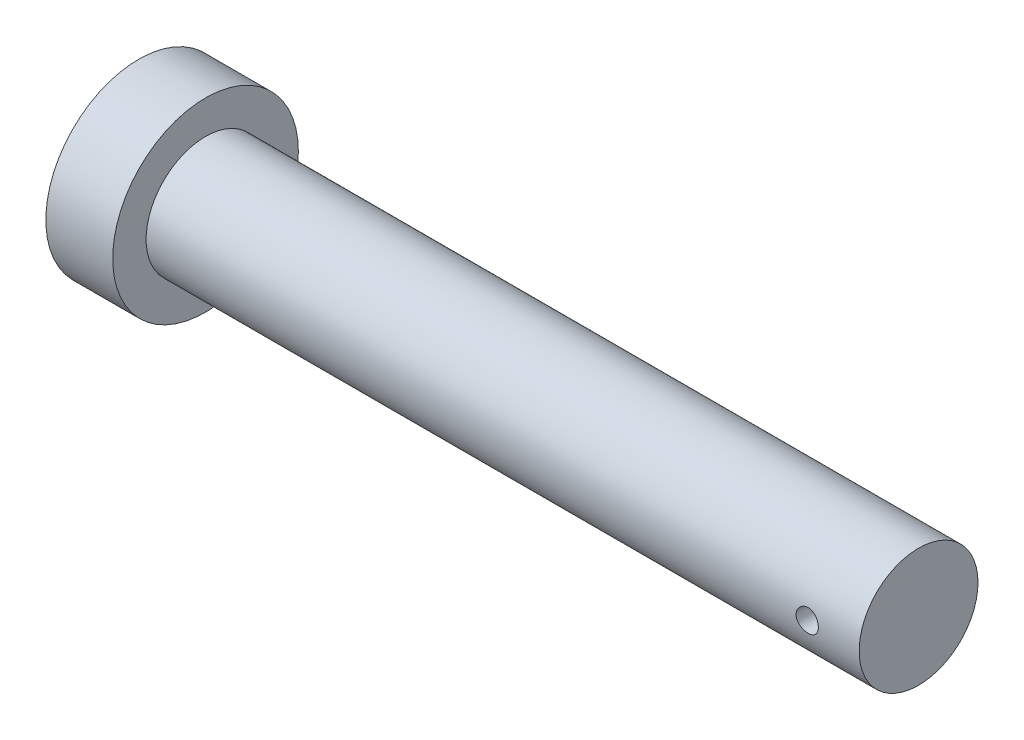
ISO-10303-21;
HEADER;
FILE_DESCRIPTION(('STEP AP214'),'2;1');
FILE_NAME('part.step','',(''),(''),'','','');
FILE_SCHEMA(('AUTOMOTIVE_DESIGN { 1 0 10303 214 1 1 1 1 }'));
ENDSEC;
DATA;
#1=APPLICATION_CONTEXT('core data for automotive mechanical design processes');
#2=APPLICATION_PROTOCOL_DEFINITION('international standard','automotive_design',2000,#1);
#3=PRODUCT_CONTEXT('',#1,'mechanical');
#4=PRODUCT('Part','Part','',(#3));
#5=PRODUCT_RELATED_PRODUCT_CATEGORY('part','',(#4));
#6=PRODUCT_DEFINITION_FORMATION('','',#4);
#7=PRODUCT_DEFINITION_CONTEXT('part definition',#1,'design');
#8=PRODUCT_DEFINITION('design','',#6,#7);
#9=PRODUCT_DEFINITION_SHAPE('','',#8);
#10=(LENGTH_UNIT() NAMED_UNIT(*) SI_UNIT(.MILLI.,.METRE.));
#11=(NAMED_UNIT(*) PLANE_ANGLE_UNIT() SI_UNIT($,.RADIAN.));
#12=(NAMED_UNIT(*) SI_UNIT($,.STERADIAN.) SOLID_ANGLE_UNIT());
#13=UNCERTAINTY_MEASURE_WITH_UNIT(LENGTH_MEASURE(1.E-05),#10,'distance_accuracy_value','');
#14=(GEOMETRIC_REPRESENTATION_CONTEXT(3) GLOBAL_UNCERTAINTY_ASSIGNED_CONTEXT((#13)) GLOBAL_UNIT_ASSIGNED_CONTEXT((#10,
#11,#12)) REPRESENTATION_CONTEXT('',''));
#15=CARTESIAN_POINT('',(0.,0.,0.));
#16=DIRECTION('',(0.,0.,1.));
#17=DIRECTION('',(1.,0.,0.));
#18=AXIS2_PLACEMENT_3D('',#15,#16,#17);
#19=CARTESIAN_POINT('',(27.9897730139607,1.81449797930322E-07,-7.30029457426593E-08));
#20=DIRECTION('',(1.,0.,0.));
#21=DIRECTION('',(0.,0.,-1.));
#22=AXIS2_PLACEMENT_3D('',#19,#20,#21);
#23=PLANE('',#22);
#24=CARTESIAN_POINT('',(27.9897730139607,1.81449797930322E-07,-7.30029457426593E-08));
#25=DIRECTION('',(1.,0.,0.));
#26=DIRECTION('',(0.,0.,-1.));
#27=AXIS2_PLACEMENT_3D('',#24,#25,#26);
#28=CIRCLE('',#27,6.25);
#29=CARTESIAN_POINT('',(27.9897730139607,1.81449797930322E-07,-6.25000007300295));
#30=VERTEX_POINT('',#29);
#31=EDGE_CURVE('E50',#30,#30,#28,.T.);
#32=ORIENTED_EDGE('',*,*,#31,.T.);
#33=EDGE_LOOP('',(#32));
#34=FACE_BOUND('',#33,.T.);
#35=CARTESIAN_POINT('',(27.9897730139607,1.81449797930322E-07,-7.30029457426593E-08));
#36=DIRECTION('',(1.,0.,0.));
#37=DIRECTION('',(0.,0.,-1.));
#38=AXIS2_PLACEMENT_3D('',#35,#36,#37);
#39=CIRCLE('',#38,4.);
#40=CARTESIAN_POINT('',(27.9897730139607,1.81449797930322E-07,-4.00000007300295));
#41=VERTEX_POINT('',#40);
#42=EDGE_CURVE('E96',#41,#41,#39,.T.);
#43=ORIENTED_EDGE('',*,*,#42,.F.);
#44=EDGE_LOOP('',(#43));
#45=FACE_BOUND('',#44,.T.);
#46=ADVANCED_FACE('F36',(#34,#45),#23,.T.);
#47=CARTESIAN_POINT('',(27.9897730139607,1.81449797930322E-07,-7.30029457426593E-08));
#48=DIRECTION('',(-1.,0.,0.));
#49=DIRECTION('',(0.,0.,1.));
#50=AXIS2_PLACEMENT_3D('',#47,#48,#49);
#51=CYLINDRICAL_SURFACE('',#50,6.25);
#52=ORIENTED_EDGE('',*,*,#31,.F.);
#53=EDGE_LOOP('',(#52));
#54=FACE_BOUND('',#53,.T.);
#55=CARTESIAN_POINT('',(23.4897730139607,1.81449797930322E-07,-7.30029457426593E-08));
#56=DIRECTION('',(1.,0.,0.));
#57=DIRECTION('',(0.,0.,-1.));
#58=AXIS2_PLACEMENT_3D('',#55,#56,#57);
#59=CIRCLE('',#58,6.25);
#60=CARTESIAN_POINT('',(23.4897730139607,1.81449797930322E-07,-6.25000007300295));
#61=VERTEX_POINT('',#60);
#62=EDGE_CURVE('E55',#61,#61,#59,.T.);
#63=ORIENTED_EDGE('',*,*,#62,.T.);
#64=EDGE_LOOP('',(#63));
#65=FACE_BOUND('',#64,.T.);
#66=ADVANCED_FACE('F38',(#54,#65),#51,.T.);
#67=CARTESIAN_POINT('',(23.4897730139607,1.81449797930322E-07,-7.30029457426593E-08));
#68=DIRECTION('',(1.,0.,0.));
#69=DIRECTION('',(0.,0.,-1.));
#70=AXIS2_PLACEMENT_3D('',#67,#68,#69);
#71=PLANE('',#70);
#72=ORIENTED_EDGE('',*,*,#62,.F.);
#73=EDGE_LOOP('',(#72));
#74=FACE_BOUND('',#73,.T.);
#75=ADVANCED_FACE('F76',(#74),#71,.F.);
#76=CARTESIAN_POINT('',(75.9897730139607,1.81449797930322E-07,-7.30029457426593E-08));
#77=DIRECTION('',(-1.,0.,0.));
#78=DIRECTION('',(0.,0.,1.));
#79=AXIS2_PLACEMENT_3D('',#76,#77,#78);
#80=CYLINDRICAL_SURFACE('',#79,4.);
#81=CARTESIAN_POINT('',(73.2397730139607,1.81449797930322E-07,-4.00000007300295));
#82=CARTESIAN_POINT('',(73.2397714191665,0.0417360546825337,-3.9999993171722));
#83=CARTESIAN_POINT('',(73.236277475651,0.0834926778148481,-3.99934012261152));
#84=CARTESIAN_POINT('',(73.2224030164015,0.165829246370697,-3.99677400245555));
#85=CARTESIAN_POINT('',(73.2120166886408,0.20640816852591,-3.99486602383743));
#86=CARTESIAN_POINT('',(73.184686663331,0.2851866623757,-3.99001576683023));
#87=CARTESIAN_POINT('',(73.1677488877344,0.323388346792474,-3.98707442273536));
#88=CARTESIAN_POINT('',(73.1278135754993,0.396404167996806,-3.98047862600186));
#89=CARTESIAN_POINT('',(73.1048165293883,0.431218578688461,-3.97682423109439));
#90=CARTESIAN_POINT('',(73.0531231299588,0.496892039415048,-3.96915675515547));
#91=CARTESIAN_POINT('',(73.0243682916256,0.527704658965713,-3.9651402472847));
#92=CARTESIAN_POINT('',(72.9621013594169,0.584098212126642,-3.9572266652962));
#93=CARTESIAN_POINT('',(72.928588924076,0.609678769896003,-3.95332959977558));
#94=CARTESIAN_POINT('',(72.8574299697787,0.655075174778758,-3.94606282922797));
#95=CARTESIAN_POINT('',(72.8197528288021,0.674843791297821,-3.94269754243386));
#96=CARTESIAN_POINT('',(72.7415385563723,0.707752803111212,-3.93692363906288));
#97=CARTESIAN_POINT('',(72.7010016719051,0.720893770015287,-3.93451493998776));
#98=CARTESIAN_POINT('',(72.6187153985035,0.740025448967296,-3.9309614208757));
#99=CARTESIAN_POINT('',(72.5769854653589,0.746097132409992,-3.92980229983497));
#100=CARTESIAN_POINT('',(72.4930843215566,0.751169221926529,-3.92883605876675));
#101=CARTESIAN_POINT('',(72.4509131508095,0.750170262126666,-3.92902881749674));
#102=CARTESIAN_POINT('',(72.3679132513276,0.741195079461608,-3.93073153651171));
#103=CARTESIAN_POINT('',(72.3270741568106,0.73331093143002,-3.93222411373962));
#104=CARTESIAN_POINT('',(72.2473088040694,0.710934178430828,-3.93633098942628));
#105=CARTESIAN_POINT('',(72.208382627206,0.69644129264729,-3.93894533555053));
#106=CARTESIAN_POINT('',(72.1332786744605,0.661168417346293,-3.94501934946589));
#107=CARTESIAN_POINT('',(72.0971187786703,0.640351249112074,-3.94848399211978));
#108=CARTESIAN_POINT('',(72.0287706496905,0.593047026101874,-3.95586493101754));
#109=CARTESIAN_POINT('',(71.9965828201033,0.566559395896123,-3.95978127308056));
#110=CARTESIAN_POINT('',(71.9365605361244,0.508169709876281,-3.96770007936377));
#111=CARTESIAN_POINT('',(71.9088026877348,0.476188899880133,-3.9717029281231));
#112=CARTESIAN_POINT('',(71.859034393623,0.407984199999207,-3.97928700354454));
#113=CARTESIAN_POINT('',(71.8370240055254,0.371760267577681,-3.98286822597917));
#114=CARTESIAN_POINT('',(71.7993641370257,0.296017675887132,-3.98921277139049));
#115=CARTESIAN_POINT('',(71.7837226244017,0.256494963673043,-3.99197506868439));
#116=CARTESIAN_POINT('',(71.7593219674146,0.175319739149143,-3.99636260001654));
#117=CARTESIAN_POINT('',(71.750562091938,0.133667453588689,-3.99798795484292));
#118=CARTESIAN_POINT('',(71.7402799984515,0.0500745079014888,-3.99990187621285));
#119=CARTESIAN_POINT('',(71.7386528181958,0.0081471877668641,-4.00020982756434));
#120=CARTESIAN_POINT('',(71.7424007537345,-0.0753804425962957,-3.99950779099409));
#121=CARTESIAN_POINT('',(71.7477755254933,-0.116980768790397,-3.9984978678251));
#122=CARTESIAN_POINT('',(71.7652875315523,-0.19834060515931,-3.99528563050498));
#123=CARTESIAN_POINT('',(71.7773716552296,-0.238111949073231,-3.9930926848731));
#124=CARTESIAN_POINT('',(71.8079018673501,-0.315064134462515,-3.98775928406544));
#125=CARTESIAN_POINT('',(71.8263483877436,-0.352244799847752,-3.98461876455962));
#126=CARTESIAN_POINT('',(71.8693120780404,-0.423408154306807,-3.97769022479128));
#127=CARTESIAN_POINT('',(71.8938933832291,-0.457351457057757,-3.97389550387576));
#128=CARTESIAN_POINT('',(71.9483420826418,-0.52066898018247,-3.9660967904515));
#129=CARTESIAN_POINT('',(71.9782099704613,-0.550042773430635,-3.96209277842638));
#130=CARTESIAN_POINT('',(72.0428591734164,-0.603786297910444,-3.9542624514902));
#131=CARTESIAN_POINT('',(72.0777004680234,-0.628084399643087,-3.95043920230423));
#132=CARTESIAN_POINT('',(72.1510318262225,-0.670483193839137,-3.94346500089561));
#133=CARTESIAN_POINT('',(72.1895217541459,-0.688584116619823,-3.94031402368969));
#134=CARTESIAN_POINT('',(72.2688759475819,-0.717973186114318,-3.93506519405081));
#135=CARTESIAN_POINT('',(72.3097277037404,-0.729294162524134,-3.93296227518734));
#136=CARTESIAN_POINT('',(72.3927966252214,-0.744903215181379,-3.93003609201502));
#137=CARTESIAN_POINT('',(72.4350136359459,-0.749192084903742,-3.92921268333189));
#138=CARTESIAN_POINT('',(72.5188971796814,-0.750588629291974,-3.92894607202223));
#139=CARTESIAN_POINT('',(72.5605618044392,-0.747809293567695,-3.92948115287441));
#140=CARTESIAN_POINT('',(72.6428187249833,-0.735395695444214,-3.93182307630294));
#141=CARTESIAN_POINT('',(72.6834110271744,-0.725761473996859,-3.93362991128168));
#142=CARTESIAN_POINT('',(72.7623102563584,-0.699959256466519,-3.93830261311884));
#143=CARTESIAN_POINT('',(72.8006213096336,-0.683803495536468,-3.94116649597777));
#144=CARTESIAN_POINT('',(72.8740071410811,-0.645429163111228,-3.94763201076214));
#145=CARTESIAN_POINT('',(72.9090816903831,-0.623210163291132,-3.95123369480354));
#146=CARTESIAN_POINT('',(72.9755648539818,-0.572947255247878,-3.95883640354167));
#147=CARTESIAN_POINT('',(73.0069107202442,-0.54482111787172,-3.96284259976816));
#148=CARTESIAN_POINT('',(73.0644755951929,-0.483713781921347,-3.97076424259662));
#149=CARTESIAN_POINT('',(73.0906934244507,-0.450731469496008,-3.97467966813959));
#150=CARTESIAN_POINT('',(73.1374784902742,-0.380492291086139,-3.98201995284319));
#151=CARTESIAN_POINT('',(73.157992728206,-0.343199613870464,-3.98544007795575));
#152=CARTESIAN_POINT('',(73.1924318322632,-0.265644875377123,-3.99135816990638));
#153=CARTESIAN_POINT('',(73.2063628874841,-0.225385644402828,-3.99385700239813));
#154=CARTESIAN_POINT('',(73.22441167117,-0.15417341996278,-3.99714152654111));
#155=CARTESIAN_POINT('',(73.2301623291171,-0.123636723676139,-3.99820742739398));
#156=CARTESIAN_POINT('',(73.2378435450189,-0.0620704421077821,-3.999636972773));
#157=CARTESIAN_POINT('',(73.2397742000886,-0.0310408693765574,-4.00000063515197));
#158=CARTESIAN_POINT('',(73.2397730139607,1.81449797930322E-07,-4.00000007300295));
#159=B_SPLINE_CURVE_WITH_KNOTS('',3,(#81,#82,#83,#84,#85,#86,#87,#88,#89,#90,#91,#92,#93,#94,
#95,#96,#97,#98,#99,#100,#101,#102,#103,#104,#105,#106,#107,#108,#109,#110,#111,#112,#113,#114,
#115,#116,#117,#118,#119,#120,#121,#122,#123,#124,#125,#126,#127,#128,#129,#130,#131,#132,#133,
#134,#135,#136,#137,#138,#139,#140,#141,#142,#143,#144,#145,#146,#147,#148,#149,#150,#151,#152,
#153,#154,#155,#156,#157,#158),.UNSPECIFIED.,.T.,.F.,(4,2,2,2,2,2,2,2,2,2,2,2,2,2,2,2,2,2,2,2,2,
2,2,2,2,2,2,2,2,2,2,2,2,2,2,2,2,2,4),(0.,0.125094100482462,0.250293821267729,0.375380635615461,
0.50045732668446,0.626875590068152,0.753302931418084,0.88073095252177,1.00814798155974,
1.13409075722668,1.26002223793628,1.38429500306384,1.50857304923393,1.63359631314766,
1.7586322702493,1.88563884232038,2.01264668772473,2.13981294160849,2.26696568336872,
2.39224087038048,2.51750990232291,2.64180116953913,2.76610087669015,2.89175889008853,
3.01742864206549,3.1447671849365,3.27210099477473,3.3988131390928,3.52551098473256,
3.65019626115874,3.77488079270752,3.89933248103845,4.0237929632771,4.1501168498319,
4.27646975631126,4.40396024458156,4.53133063465585,4.62437172262204,4.71741044519769),.UNSPECIFIED.);
#160=CARTESIAN_POINT('',(73.2397730139607,1.81449797930322E-07,-4.00000007300295));
#161=VERTEX_POINT('',#160);
#162=EDGE_CURVE('E40',#161,#161,#159,.T.);
#163=ORIENTED_EDGE('',*,*,#162,.T.);
#164=EDGE_LOOP('',(#163));
#165=FACE_BOUND('',#164,.T.);
#166=CARTESIAN_POINT('',(73.2397730139607,1.81449797930322E-07,3.99999992699706));
#167=CARTESIAN_POINT('',(73.2397714191665,-0.0417356917829378,3.99999917116632));
#168=CARTESIAN_POINT('',(73.236277475651,-0.0834923149152521,3.99933997660563));
#169=CARTESIAN_POINT('',(73.2224030164015,-0.165828883471101,3.99677385644965));
#170=CARTESIAN_POINT('',(73.2120166886408,-0.206407805626314,3.99486587783154));
#171=CARTESIAN_POINT('',(73.184686663331,-0.285186299476104,3.99001562082434));
#172=CARTESIAN_POINT('',(73.1677488877344,-0.323387983892878,3.98707427672947));
#173=CARTESIAN_POINT('',(73.1278135754993,-0.39640380509721,3.98047847999597));
#174=CARTESIAN_POINT('',(73.1048165293883,-0.431218215788865,3.9768240850885));
#175=CARTESIAN_POINT('',(73.0531231299588,-0.496891676515452,3.96915660914958));
#176=CARTESIAN_POINT('',(73.0243682916256,-0.527704296066117,3.96514010127881));
#177=CARTESIAN_POINT('',(72.9621013594169,-0.584097849227047,3.95722651929031));
#178=CARTESIAN_POINT('',(72.928588924076,-0.609678406996407,3.95332945376969));
#179=CARTESIAN_POINT('',(72.8574299697787,-0.655074811879162,3.94606268322208));
#180=CARTESIAN_POINT('',(72.8197528288021,-0.674843428398226,3.94269739642797));
#181=CARTESIAN_POINT('',(72.7415385563723,-0.707752440211616,3.93692349305699));
#182=CARTESIAN_POINT('',(72.7010016719051,-0.720893407115691,3.93451479398187));
#183=CARTESIAN_POINT('',(72.6187153985035,-0.7400250860677,3.93096127486981));
#184=CARTESIAN_POINT('',(72.5769854653589,-0.746096769510395,3.92980215382908));
#185=CARTESIAN_POINT('',(72.4930843215566,-0.751168859026933,3.92883591276086));
#186=CARTESIAN_POINT('',(72.4509131508095,-0.750169899227071,3.92902867149085));
#187=CARTESIAN_POINT('',(72.3679132513276,-0.741194716562013,3.93073139050582));
#188=CARTESIAN_POINT('',(72.3270741568106,-0.733310568530424,3.93222396773372));
#189=CARTESIAN_POINT('',(72.2473088040694,-0.710933815531233,3.93633084342039));
#190=CARTESIAN_POINT('',(72.208382627206,-0.696440929747694,3.93894518954464));
#191=CARTESIAN_POINT('',(72.1332786744605,-0.661168054446697,3.94501920346));
#192=CARTESIAN_POINT('',(72.0971187786703,-0.640350886212478,3.94848384611388));
#193=CARTESIAN_POINT('',(72.0287706496905,-0.593046663202279,3.95586478501165));
#194=CARTESIAN_POINT('',(71.9965828201033,-0.566559032996527,3.95978112707467));
#195=CARTESIAN_POINT('',(71.9365605361244,-0.508169346976685,3.96769993335788));
#196=CARTESIAN_POINT('',(71.9088026877348,-0.476188536980537,3.97170278211721));
#197=CARTESIAN_POINT('',(71.859034393623,-0.407983837099611,3.97928685753865));
#198=CARTESIAN_POINT('',(71.8370240055254,-0.371759904678085,3.98286807997328));
#199=CARTESIAN_POINT('',(71.7993641370257,-0.296017312987536,3.9892126253846));
#200=CARTESIAN_POINT('',(71.7837226244017,-0.256494600773447,3.9919749226785));
#201=CARTESIAN_POINT('',(71.7593219674146,-0.175319376249547,3.99636245401065));
#202=CARTESIAN_POINT('',(71.750562091938,-0.133667090689093,3.99798780883702));
#203=CARTESIAN_POINT('',(71.7402799984515,-0.0500741450018931,3.99990173020696));
#204=CARTESIAN_POINT('',(71.7386528181958,-0.00814682486726844,4.00020968155845));
#205=CARTESIAN_POINT('',(71.7424007537345,0.0753808054958915,3.99950764498819));
#206=CARTESIAN_POINT('',(71.7477755254933,0.116981131689993,3.99849772181921));
#207=CARTESIAN_POINT('',(71.7652875315523,0.198340968058906,3.99528548449909));
#208=CARTESIAN_POINT('',(71.7773716552296,0.238112311972826,3.99309253886721));
#209=CARTESIAN_POINT('',(71.8079018673501,0.315064497362111,3.98775913805955));
#210=CARTESIAN_POINT('',(71.8263483877436,0.352245162747348,3.98461861855373));
#211=CARTESIAN_POINT('',(71.8693120780404,0.423408517206402,3.97769007878538));
#212=CARTESIAN_POINT('',(71.8938933832291,0.457351819957353,3.97389535786987));
#213=CARTESIAN_POINT('',(71.9483420826418,0.520669343082066,3.96609664444561));
#214=CARTESIAN_POINT('',(71.9782099704613,0.550043136330231,3.96209263242049));
#215=CARTESIAN_POINT('',(72.0428591734164,0.60378666081004,3.95426230548431));
#216=CARTESIAN_POINT('',(72.0777004680234,0.628084762542683,3.95043905629834));
#217=CARTESIAN_POINT('',(72.1510318262225,0.670483556738733,3.94346485488971));
#218=CARTESIAN_POINT('',(72.1895217541459,0.688584479519419,3.9403138776838));
#219=CARTESIAN_POINT('',(72.2688759475819,0.717973549013913,3.93506504804492));
#220=CARTESIAN_POINT('',(72.3097277037404,0.72929452542373,3.93296212918145));
#221=CARTESIAN_POINT('',(72.3927966252214,0.744903578080974,3.93003594600913));
#222=CARTESIAN_POINT('',(72.4350136359459,0.749192447803338,3.929212537326));
#223=CARTESIAN_POINT('',(72.5188971796814,0.75058899219157,3.92894592601634));
#224=CARTESIAN_POINT('',(72.5605618044392,0.747809656467291,3.92948100686852));
#225=CARTESIAN_POINT('',(72.6428187249833,0.73539605834381,3.93182293029705));
#226=CARTESIAN_POINT('',(72.6834110271744,0.725761836896455,3.93362976527579));
#227=CARTESIAN_POINT('',(72.7623102563584,0.699959619366114,3.93830246711295));
#228=CARTESIAN_POINT('',(72.8006213096336,0.683803858436064,3.94116634997188));
#229=CARTESIAN_POINT('',(72.8740071410811,0.645429526010823,3.94763186475625));
#230=CARTESIAN_POINT('',(72.9090816903831,0.623210526190728,3.95123354879765));
#231=CARTESIAN_POINT('',(72.9755648539818,0.572947618147473,3.95883625753578));
#232=CARTESIAN_POINT('',(73.0069107202442,0.544821480771316,3.96284245376227));
#233=CARTESIAN_POINT('',(73.0644755951929,0.483714144820943,3.97076409659073));
#234=CARTESIAN_POINT('',(73.0906934244507,0.450731832395604,3.9746795221337));
#235=CARTESIAN_POINT('',(73.1374784902742,0.380492653985735,3.9820198068373));
#236=CARTESIAN_POINT('',(73.157992728206,0.34319997677006,3.98543993194986));
#237=CARTESIAN_POINT('',(73.1924318322632,0.265645238276719,3.99135802390049));
#238=CARTESIAN_POINT('',(73.2063628874841,0.225386007302424,3.99385685639224));
#239=CARTESIAN_POINT('',(73.22441167117,0.154173782862376,3.99714138053521));
#240=CARTESIAN_POINT('',(73.2301623291171,0.123637086575734,3.99820728138809));
#241=CARTESIAN_POINT('',(73.2378435450189,0.0620708050073779,3.99963682676711));
#242=CARTESIAN_POINT('',(73.2397742000886,0.0310412322761532,4.00000048914608));
#243=CARTESIAN_POINT('',(73.2397730139607,1.81449797930322E-07,3.99999992699706));
#244=B_SPLINE_CURVE_WITH_KNOTS('',3,(#166,#167,#168,#169,#170,#171,#172,#173,#174,#175,#176,
#177,#178,#179,#180,#181,#182,#183,#184,#185,#186,#187,#188,#189,#190,#191,#192,#193,#194,#195,
#196,#197,#198,#199,#200,#201,#202,#203,#204,#205,#206,#207,#208,#209,#210,#211,#212,#213,#214,
#215,#216,#217,#218,#219,#220,#221,#222,#223,#224,#225,#226,#227,#228,#229,#230,#231,#232,#233,
#234,#235,#236,#237,#238,#239,#240,#241,#242,#243),.UNSPECIFIED.,.T.,.F.,(4,2,2,2,2,2,2,2,2,2,2,
2,2,2,2,2,2,2,2,2,2,2,2,2,2,2,2,2,2,2,2,2,2,2,2,2,2,2,4),(0.,0.125094100482462,
0.250293821267729,0.375380635615461,0.50045732668446,0.626875590068152,0.753302931418084,
0.88073095252177,1.00814798155974,1.13409075722667,1.26002223793628,1.38429500306384,
1.50857304923393,1.63359631314766,1.7586322702493,1.88563884232038,2.01264668772473,
2.13981294160849,2.26696568336872,2.39224087038048,2.51750990232291,2.64180116953913,
2.76610087669015,2.89175889008853,3.01742864206549,3.1447671849365,3.27210099477473,
3.3988131390928,3.52551098473256,3.65019626115874,3.77488079270752,3.89933248103845,
4.0237929632771,4.1501168498319,4.27646975631126,4.40396024458156,4.53133063465585,
4.62437172262204,4.71741044519769),.UNSPECIFIED.);
#245=CARTESIAN_POINT('',(73.2397730139607,1.81449797930322E-07,3.99999992699706));
#246=VERTEX_POINT('',#245);
#247=EDGE_CURVE('E10',#246,#246,#244,.T.);
#248=ORIENTED_EDGE('',*,*,#247,.T.);
#249=EDGE_LOOP('',(#248));
#250=FACE_BOUND('',#249,.T.);
#251=CARTESIAN_POINT('',(75.9897730139607,1.81449797930322E-07,-7.30029457426593E-08));
#252=DIRECTION('',(1.,0.,0.));
#253=DIRECTION('',(0.,0.,-1.));
#254=AXIS2_PLACEMENT_3D('',#251,#252,#253);
#255=CIRCLE('',#254,4.);
#256=CARTESIAN_POINT('',(75.9897730139607,1.81449797930322E-07,-4.00000007300295));
#257=VERTEX_POINT('',#256);
#258=EDGE_CURVE('E94',#257,#257,#255,.T.);
#259=ORIENTED_EDGE('',*,*,#258,.F.);
#260=EDGE_LOOP('',(#259));
#261=FACE_BOUND('',#260,.T.);
#262=ORIENTED_EDGE('',*,*,#42,.T.);
#263=EDGE_LOOP('',(#262));
#264=FACE_BOUND('',#263,.T.);
#265=ADVANCED_FACE('F61',(#165,#250,#261,#264),#80,.T.);
#266=CARTESIAN_POINT('',(75.9897730139607,1.81449797930322E-07,-7.30029457426593E-08));
#267=DIRECTION('',(1.,0.,0.));
#268=DIRECTION('',(0.,0.,-1.));
#269=AXIS2_PLACEMENT_3D('',#266,#267,#268);
#270=PLANE('',#269);
#271=ORIENTED_EDGE('',*,*,#258,.T.);
#272=EDGE_LOOP('',(#271));
#273=FACE_BOUND('',#272,.T.);
#274=ADVANCED_FACE('F68',(#273),#270,.T.);
#275=CARTESIAN_POINT('',(72.4897730139607,1.81449797930322E-07,-44.0000000730029));
#276=DIRECTION('',(0.,0.,1.));
#277=DIRECTION('',(1.,0.,0.));
#278=AXIS2_PLACEMENT_3D('',#275,#276,#277);
#279=CYLINDRICAL_SURFACE('',#278,0.749999999999999);
#280=ORIENTED_EDGE('',*,*,#162,.F.);
#281=EDGE_LOOP('',(#280));
#282=FACE_BOUND('',#281,.T.);
#283=ORIENTED_EDGE('',*,*,#247,.F.);
#284=EDGE_LOOP('',(#283));
#285=FACE_BOUND('',#284,.T.);
#286=ADVANCED_FACE('F65',(#282,#285),#279,.F.);
#287=CLOSED_SHELL('',(#46,#66,#75,#265,#274,#286));
#288=MANIFOLD_SOLID_BREP('B2',#287);
#289=ADVANCED_BREP_SHAPE_REPRESENTATION('',(#18,#288),#14);
#290=SHAPE_DEFINITION_REPRESENTATION(#9,#289);
ENDSEC;
END-ISO-10303-21;
